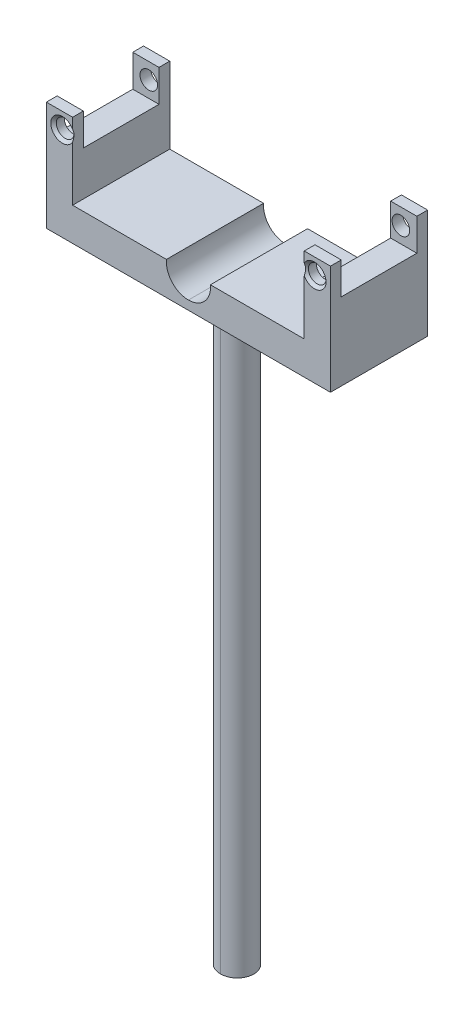
ISO-10303-21;
HEADER;
FILE_DESCRIPTION(('STEP AP214'),'2;1');
FILE_NAME('part.step','',(''),(''),'','','');
FILE_SCHEMA(('AUTOMOTIVE_DESIGN { 1 0 10303 214 1 1 1 1 }'));
ENDSEC;
DATA;
#1=APPLICATION_CONTEXT('core data for automotive mechanical design processes');
#2=APPLICATION_PROTOCOL_DEFINITION('international standard','automotive_design',2000,#1);
#3=PRODUCT_CONTEXT('',#1,'mechanical');
#4=PRODUCT('Part','Part','',(#3));
#5=PRODUCT_RELATED_PRODUCT_CATEGORY('part','',(#4));
#6=PRODUCT_DEFINITION_FORMATION('','',#4);
#7=PRODUCT_DEFINITION_CONTEXT('part definition',#1,'design');
#8=PRODUCT_DEFINITION('design','',#6,#7);
#9=PRODUCT_DEFINITION_SHAPE('','',#8);
#10=(LENGTH_UNIT() NAMED_UNIT(*) SI_UNIT(.MILLI.,.METRE.));
#11=(NAMED_UNIT(*) PLANE_ANGLE_UNIT() SI_UNIT($,.RADIAN.));
#12=(NAMED_UNIT(*) SI_UNIT($,.STERADIAN.) SOLID_ANGLE_UNIT());
#13=UNCERTAINTY_MEASURE_WITH_UNIT(LENGTH_MEASURE(1.E-05),#10,'distance_accuracy_value','');
#14=(GEOMETRIC_REPRESENTATION_CONTEXT(3) GLOBAL_UNCERTAINTY_ASSIGNED_CONTEXT((#13)) GLOBAL_UNIT_ASSIGNED_CONTEXT((#10,
#11,#12)) REPRESENTATION_CONTEXT('',''));
#15=CARTESIAN_POINT('',(0.,0.,0.));
#16=DIRECTION('',(0.,0.,1.));
#17=DIRECTION('',(1.,0.,0.));
#18=AXIS2_PLACEMENT_3D('',#15,#16,#17);
#19=CARTESIAN_POINT('',(0.,19.8,17.6));
#20=DIRECTION('',(0.,-1.,0.));
#21=DIRECTION('',(0.,0.,-1.));
#22=AXIS2_PLACEMENT_3D('',#19,#20,#21);
#23=PLANE('',#22);
#24=DIRECTION('',(0.,0.,-1.));
#25=VECTOR('',#24,1.);
#26=CARTESIAN_POINT('',(0.,19.8,17.6));
#27=LINE('',#26,#25);
#28=CARTESIAN_POINT('',(0.,19.8,1.95));
#29=VERTEX_POINT('',#28);
#30=CARTESIAN_POINT('',(0.,19.8,0.));
#31=VERTEX_POINT('',#30);
#32=EDGE_CURVE('E430',#29,#31,#27,.T.);
#33=ORIENTED_EDGE('',*,*,#32,.F.);
#34=DIRECTION('',(-1.,0.,0.));
#35=VECTOR('',#34,1.);
#36=CARTESIAN_POINT('',(0.,19.8,1.95));
#37=LINE('',#36,#35);
#38=CARTESIAN_POINT('',(4.750417,19.8,1.95));
#39=VERTEX_POINT('',#38);
#40=EDGE_CURVE('E431',#39,#29,#37,.T.);
#41=ORIENTED_EDGE('',*,*,#40,.F.);
#42=DIRECTION('',(0.,0.,-1.));
#43=VECTOR('',#42,1.);
#44=CARTESIAN_POINT('',(4.750417,19.8,17.6));
#45=LINE('',#44,#43);
#46=CARTESIAN_POINT('',(4.750417,19.8,0.));
#47=VERTEX_POINT('',#46);
#48=EDGE_CURVE('E441',#39,#47,#45,.T.);
#49=ORIENTED_EDGE('',*,*,#48,.T.);
#50=DIRECTION('',(-1.,0.,0.));
#51=VECTOR('',#50,1.);
#52=CARTESIAN_POINT('',(0.,19.8,0.));
#53=LINE('',#52,#51);
#54=EDGE_CURVE('E434',#47,#31,#53,.T.);
#55=ORIENTED_EDGE('',*,*,#54,.T.);
#56=EDGE_LOOP('',(#33,#41,#49,#55));
#57=FACE_BOUND('',#56,.T.);
#58=ADVANCED_FACE('F43',(#57),#23,.F.);
#59=CARTESIAN_POINT('',(0.,0.,17.6));
#60=DIRECTION('',(0.,1.,0.));
#61=DIRECTION('',(0.,0.,1.));
#62=AXIS2_PLACEMENT_3D('',#59,#60,#61);
#63=PLANE('',#62);
#64=CARTESIAN_POINT('',(25.6846208878539,0.,8.80012215097253));
#65=DIRECTION('',(0.,1.,0.));
#66=DIRECTION('',(0.,0.,1.));
#67=AXIS2_PLACEMENT_3D('',#64,#65,#66);
#68=CIRCLE('',#67,7.);
#69=CARTESIAN_POINT('',(25.7309872786519,0.,1.80027571281373));
#70=VERTEX_POINT('',#69);
#71=CARTESIAN_POINT('',(25.7309872786519,0.,15.7999685891313));
#72=VERTEX_POINT('',#71);
#73=EDGE_CURVE('E464',#70,#72,#68,.T.);
#74=ORIENTED_EDGE('',*,*,#73,.T.);
#75=CARTESIAN_POINT('',(25.7773536694498,0.,8.80012215097253));
#76=DIRECTION('',(0.,-1.,0.));
#77=DIRECTION('',(0.,0.,1.));
#78=AXIS2_PLACEMENT_3D('',#75,#76,#77);
#79=CIRCLE('',#78,7.);
#80=EDGE_CURVE('E304',#70,#72,#79,.T.);
#81=ORIENTED_EDGE('',*,*,#80,.F.);
#82=EDGE_LOOP('',(#74,#81));
#83=FACE_BOUND('',#82,.T.);
#84=DIRECTION('',(1.,0.,0.));
#85=VECTOR('',#84,1.);
#86=CARTESIAN_POINT('',(0.,0.,0.));
#87=LINE('',#86,#85);
#88=CARTESIAN_POINT('',(0.,0.,0.));
#89=VERTEX_POINT('',#88);
#90=CARTESIAN_POINT('',(51.4619745573037,0.,0.));
#91=VERTEX_POINT('',#90);
#92=EDGE_CURVE('E482',#89,#91,#87,.T.);
#93=ORIENTED_EDGE('',*,*,#92,.T.);
#94=DIRECTION('',(0.,0.,-1.));
#95=VECTOR('',#94,1.);
#96=CARTESIAN_POINT('',(51.4619745573037,0.,17.6));
#97=LINE('',#96,#95);
#98=CARTESIAN_POINT('',(51.4619745573037,0.,17.6));
#99=VERTEX_POINT('',#98);
#100=EDGE_CURVE('E267',#99,#91,#97,.T.);
#101=ORIENTED_EDGE('',*,*,#100,.F.);
#102=DIRECTION('',(1.,0.,0.));
#103=VECTOR('',#102,1.);
#104=CARTESIAN_POINT('',(0.,0.,17.6));
#105=LINE('',#104,#103);
#106=CARTESIAN_POINT('',(0.,0.,17.6));
#107=VERTEX_POINT('',#106);
#108=EDGE_CURVE('E493',#107,#99,#105,.T.);
#109=ORIENTED_EDGE('',*,*,#108,.F.);
#110=DIRECTION('',(0.,0.,-1.));
#111=VECTOR('',#110,1.);
#112=CARTESIAN_POINT('',(0.,0.,17.6));
#113=LINE('',#112,#111);
#114=EDGE_CURVE('E438',#107,#89,#113,.T.);
#115=ORIENTED_EDGE('',*,*,#114,.T.);
#116=EDGE_LOOP('',(#93,#101,#109,#115));
#117=FACE_BOUND('',#116,.T.);
#118=ADVANCED_FACE('F413',(#83,#117),#63,.F.);
#119=CARTESIAN_POINT('',(25.7314326497335,5.61504018958305,17.6));
#120=DIRECTION('',(0.,0.,-1.));
#121=DIRECTION('',(-1.,0.,0.));
#122=AXIS2_PLACEMENT_3D('',#119,#120,#121);
#123=CYLINDRICAL_SURFACE('',#122,4.);
#124=CARTESIAN_POINT('',(25.7314326497335,5.61504018958305,0.));
#125=DIRECTION('',(0.,0.,-1.));
#126=DIRECTION('',(1.,0.,0.));
#127=AXIS2_PLACEMENT_3D('',#124,#125,#126);
#128=CIRCLE('',#127,4.);
#129=CARTESIAN_POINT('',(25.7309872786519,1.61504021437747,0.));
#130=VERTEX_POINT('',#129);
#131=CARTESIAN_POINT('',(21.75,6.,0.));
#132=VERTEX_POINT('',#131);
#133=EDGE_CURVE('E484',#130,#132,#128,.T.);
#134=ORIENTED_EDGE('',*,*,#133,.T.);
#135=DIRECTION('',(0.,0.,-1.));
#136=VECTOR('',#135,1.);
#137=CARTESIAN_POINT('',(21.75,6.,17.6));
#138=LINE('',#137,#136);
#139=CARTESIAN_POINT('',(21.75,6.,17.6));
#140=VERTEX_POINT('',#139);
#141=EDGE_CURVE('E453',#140,#132,#138,.T.);
#142=ORIENTED_EDGE('',*,*,#141,.F.);
#143=CARTESIAN_POINT('',(25.7314326497335,5.61504018958305,17.6));
#144=DIRECTION('',(0.,0.,-1.));
#145=DIRECTION('',(1.,0.,0.));
#146=AXIS2_PLACEMENT_3D('',#143,#144,#145);
#147=CIRCLE('',#146,4.);
#148=CARTESIAN_POINT('',(25.7309872786519,1.61504021437747,17.6));
#149=VERTEX_POINT('',#148);
#150=EDGE_CURVE('E476',#149,#140,#147,.T.);
#151=ORIENTED_EDGE('',*,*,#150,.F.);
#152=DIRECTION('',(0.,0.,-1.));
#153=VECTOR('',#152,1.);
#154=CARTESIAN_POINT('',(25.7309872786519,1.61504021437747,17.6));
#155=LINE('',#154,#153);
#156=EDGE_CURVE('E295',#149,#130,#155,.T.);
#157=ORIENTED_EDGE('',*,*,#156,.T.);
#158=EDGE_LOOP('',(#134,#142,#151,#157));
#159=FACE_BOUND('',#158,.T.);
#160=ADVANCED_FACE('F409',(#159),#123,.F.);
#161=CARTESIAN_POINT('',(4.750417,6.,17.6));
#162=DIRECTION('',(0.,-1.,0.));
#163=DIRECTION('',(0.,0.,-1.));
#164=AXIS2_PLACEMENT_3D('',#161,#162,#163);
#165=PLANE('',#164);
#166=DIRECTION('',(-1.,0.,0.));
#167=VECTOR('',#166,1.);
#168=CARTESIAN_POINT('',(4.750417,6.,0.));
#169=LINE('',#168,#167);
#170=CARTESIAN_POINT('',(4.750417,6.,0.));
#171=VERTEX_POINT('',#170);
#172=EDGE_CURVE('E487',#132,#171,#169,.T.);
#173=ORIENTED_EDGE('',*,*,#172,.T.);
#174=DIRECTION('',(0.,0.,-1.));
#175=VECTOR('',#174,1.);
#176=CARTESIAN_POINT('',(4.750417,6.,17.6));
#177=LINE('',#176,#175);
#178=CARTESIAN_POINT('',(4.750417,6.,17.6));
#179=VERTEX_POINT('',#178);
#180=EDGE_CURVE('E450',#179,#171,#177,.T.);
#181=ORIENTED_EDGE('',*,*,#180,.F.);
#182=DIRECTION('',(-1.,0.,0.));
#183=VECTOR('',#182,1.);
#184=CARTESIAN_POINT('',(4.750417,6.,17.6));
#185=LINE('',#184,#183);
#186=EDGE_CURVE('E473',#140,#179,#185,.T.);
#187=ORIENTED_EDGE('',*,*,#186,.F.);
#188=ORIENTED_EDGE('',*,*,#141,.T.);
#189=EDGE_LOOP('',(#173,#181,#187,#188));
#190=FACE_BOUND('',#189,.T.);
#191=ADVANCED_FACE('F406',(#190),#165,.F.);
#192=CARTESIAN_POINT('',(4.750417,19.8,17.6));
#193=DIRECTION('',(-1.,0.,0.));
#194=DIRECTION('',(0.,-1.,0.));
#195=AXIS2_PLACEMENT_3D('',#192,#193,#194);
#196=PLANE('',#195);
#197=DIRECTION('',(0.,1.,0.));
#198=VECTOR('',#197,1.);
#199=CARTESIAN_POINT('',(4.750417,19.8,17.6));
#200=LINE('',#199,#198);
#201=CARTESIAN_POINT('',(4.750417,17.8929536374429,17.6));
#202=VERTEX_POINT('',#201);
#203=CARTESIAN_POINT('',(4.750417,19.8,17.6));
#204=VERTEX_POINT('',#203);
#205=EDGE_CURVE('E468',#202,#204,#200,.T.);
#206=ORIENTED_EDGE('',*,*,#205,.F.);
#207=CARTESIAN_POINT('',(4.750417,17.8929536374429,17.6));
#208=CARTESIAN_POINT('',(4.750417,17.8237776755279,17.5673092705614));
#209=CARTESIAN_POINT('',(4.750417,17.753489699585,17.5367092353378));
#210=CARTESIAN_POINT('',(4.750417,17.6104070871282,17.4809947338341));
#211=CARTESIAN_POINT('',(4.750417,17.5376021631987,17.4559069097473));
#212=CARTESIAN_POINT('',(4.750417,17.3908553853962,17.4131482006103));
#213=CARTESIAN_POINT('',(4.750417,17.3169421249411,17.3953818109212));
#214=CARTESIAN_POINT('',(4.750417,17.1676977650916,17.3682472863502));
#215=CARTESIAN_POINT('',(4.750417,17.0923698621162,17.3588621102523));
#216=CARTESIAN_POINT('',(4.750417,16.9589342381472,17.3504528214111));
#217=CARTESIAN_POINT('',(4.750417,16.9009432675724,17.3495110079596));
#218=CARTESIAN_POINT('',(4.750417,16.7851084369904,17.3530768047883));
#219=CARTESIAN_POINT('',(4.750417,16.7272646320856,17.357586220559));
#220=CARTESIAN_POINT('',(4.750417,16.6121960179764,17.3717929211864));
#221=CARTESIAN_POINT('',(4.750417,16.554971584294,17.3814931911676));
#222=CARTESIAN_POINT('',(4.750417,16.4415053807776,17.4055665603144));
#223=CARTESIAN_POINT('',(4.750417,16.3852639996284,17.4199414656098));
#224=CARTESIAN_POINT('',(4.750417,16.2569810909495,17.4577254730156));
#225=CARTESIAN_POINT('',(4.750417,16.1853633405545,17.4825529316152));
#226=CARTESIAN_POINT('',(4.750417,16.0444877671429,17.5375888191941));
#227=CARTESIAN_POINT('',(4.750417,15.975222782737,17.5677787679069));
#228=CARTESIAN_POINT('',(4.750417,15.9070463625571,17.6));
#229=B_SPLINE_CURVE_WITH_KNOTS('',3,(#207,#208,#209,#210,#211,#212,#213,#214,#215,#216,#217,
#218,#219,#220,#221,#222,#223,#224,#225,#226,#227,#228),.UNSPECIFIED.,.F.,.F.,(4,2,2,2,2,2,2,2,
2,2,4),(0.,0.229669236507095,0.460425239622334,0.688067809608706,0.915246461414479,
1.08899431652335,1.26279973407762,1.4367052101676,1.61067795776462,1.83781530457767,
2.06418456088828),.UNSPECIFIED.);
#230=CARTESIAN_POINT('',(4.750417,15.9070463625571,17.6));
#231=VERTEX_POINT('',#230);
#232=EDGE_CURVE('E11',#202,#231,#229,.T.);
#233=ORIENTED_EDGE('',*,*,#232,.T.);
#234=EDGE_CURVE('E470',#179,#231,#200,.T.);
#235=ORIENTED_EDGE('',*,*,#234,.F.);
#236=ORIENTED_EDGE('',*,*,#180,.T.);
#237=DIRECTION('',(0.,1.,0.));
#238=VECTOR('',#237,1.);
#239=CARTESIAN_POINT('',(4.750417,19.8,0.));
#240=LINE('',#239,#238);
#241=EDGE_CURVE('E489',#171,#47,#240,.T.);
#242=ORIENTED_EDGE('',*,*,#241,.T.);
#243=ORIENTED_EDGE('',*,*,#48,.F.);
#244=DIRECTION('',(0.,1.,0.));
#245=VECTOR('',#244,1.);
#246=CARTESIAN_POINT('',(4.750417,14.,1.95));
#247=LINE('',#246,#245);
#248=CARTESIAN_POINT('',(4.750417,14.,1.95));
#249=VERTEX_POINT('',#248);
#250=EDGE_CURVE('E503',#249,#39,#247,.T.);
#251=ORIENTED_EDGE('',*,*,#250,.F.);
#252=DIRECTION('',(0.,0.,-1.));
#253=VECTOR('',#252,1.);
#254=CARTESIAN_POINT('',(4.750417,14.,1.95));
#255=LINE('',#254,#253);
#256=CARTESIAN_POINT('',(4.750417,14.,15.65));
#257=VERTEX_POINT('',#256);
#258=EDGE_CURVE('E511',#257,#249,#255,.T.);
#259=ORIENTED_EDGE('',*,*,#258,.F.);
#260=DIRECTION('',(0.,1.,0.));
#261=VECTOR('',#260,1.);
#262=CARTESIAN_POINT('',(4.750417,14.,15.65));
#263=LINE('',#262,#261);
#264=CARTESIAN_POINT('',(4.750417,19.8,15.65));
#265=VERTEX_POINT('',#264);
#266=EDGE_CURVE('E500',#257,#265,#263,.T.);
#267=ORIENTED_EDGE('',*,*,#266,.T.);
#268=EDGE_CURVE('E447',#204,#265,#45,.T.);
#269=ORIENTED_EDGE('',*,*,#268,.F.);
#270=EDGE_LOOP('',(#206,#233,#235,#236,#242,#243,#251,#259,#267,#269));
#271=FACE_BOUND('',#270,.T.);
#272=ADVANCED_FACE('F401',(#271),#196,.F.);
#273=ORIENTED_EDGE('',*,*,#268,.T.);
#274=DIRECTION('',(1.,0.,0.));
#275=VECTOR('',#274,1.);
#276=CARTESIAN_POINT('',(0.,19.8,15.65));
#277=LINE('',#276,#275);
#278=CARTESIAN_POINT('',(0.,19.8,15.65));
#279=VERTEX_POINT('',#278);
#280=EDGE_CURVE('E508',#279,#265,#277,.T.);
#281=ORIENTED_EDGE('',*,*,#280,.F.);
#282=CARTESIAN_POINT('',(0.,19.8,17.6));
#283=VERTEX_POINT('',#282);
#284=EDGE_CURVE('E437',#283,#279,#27,.T.);
#285=ORIENTED_EDGE('',*,*,#284,.F.);
#286=DIRECTION('',(-1.,0.,0.));
#287=VECTOR('',#286,1.);
#288=CARTESIAN_POINT('',(0.,19.8,17.6));
#289=LINE('',#288,#287);
#290=EDGE_CURVE('E475',#204,#283,#289,.T.);
#291=ORIENTED_EDGE('',*,*,#290,.F.);
#292=EDGE_LOOP('',(#273,#281,#285,#291));
#293=FACE_BOUND('',#292,.T.);
#294=ADVANCED_FACE('F398',(#293),#23,.F.);
#295=CARTESIAN_POINT('',(0.,0.,17.6));
#296=DIRECTION('',(1.,0.,0.));
#297=DIRECTION('',(0.,0.,-1.));
#298=AXIS2_PLACEMENT_3D('',#295,#296,#297);
#299=PLANE('',#298);
#300=DIRECTION('',(0.,0.,1.));
#301=VECTOR('',#300,1.);
#302=CARTESIAN_POINT('',(0.,14.,1.95));
#303=LINE('',#302,#301);
#304=CARTESIAN_POINT('',(0.,14.,1.95));
#305=VERTEX_POINT('',#304);
#306=CARTESIAN_POINT('',(0.,14.,15.65));
#307=VERTEX_POINT('',#306);
#308=EDGE_CURVE('E507',#305,#307,#303,.T.);
#309=ORIENTED_EDGE('',*,*,#308,.F.);
#310=DIRECTION('',(0.,1.,0.));
#311=VECTOR('',#310,1.);
#312=CARTESIAN_POINT('',(0.,14.,1.95));
#313=LINE('',#312,#311);
#314=EDGE_CURVE('E485',#305,#29,#313,.T.);
#315=ORIENTED_EDGE('',*,*,#314,.T.);
#316=ORIENTED_EDGE('',*,*,#32,.T.);
#317=DIRECTION('',(0.,-1.,0.));
#318=VECTOR('',#317,1.);
#319=CARTESIAN_POINT('',(0.,0.,0.));
#320=LINE('',#319,#318);
#321=EDGE_CURVE('E492',#31,#89,#320,.T.);
#322=ORIENTED_EDGE('',*,*,#321,.T.);
#323=ORIENTED_EDGE('',*,*,#114,.F.);
#324=DIRECTION('',(0.,-1.,0.));
#325=VECTOR('',#324,1.);
#326=CARTESIAN_POINT('',(0.,0.,17.6));
#327=LINE('',#326,#325);
#328=EDGE_CURVE('E443',#283,#107,#327,.T.);
#329=ORIENTED_EDGE('',*,*,#328,.F.);
#330=ORIENTED_EDGE('',*,*,#284,.T.);
#331=DIRECTION('',(0.,1.,0.));
#332=VECTOR('',#331,1.);
#333=CARTESIAN_POINT('',(0.,14.,15.65));
#334=LINE('',#333,#332);
#335=EDGE_CURVE('E498',#307,#279,#334,.T.);
#336=ORIENTED_EDGE('',*,*,#335,.F.);
#337=EDGE_LOOP('',(#309,#315,#316,#322,#323,#329,#330,#336));
#338=FACE_BOUND('',#337,.T.);
#339=ADVANCED_FACE('F391',(#338),#299,.F.);
#340=CARTESIAN_POINT('',(25.7314326497335,5.61504018958305,17.6));
#341=DIRECTION('',(0.,0.,1.));
#342=DIRECTION('',(1.,0.,0.));
#343=AXIS2_PLACEMENT_3D('',#340,#341,#342);
#344=PLANE('',#343);
#345=ORIENTED_EDGE('',*,*,#234,.T.);
#346=CARTESIAN_POINT('',(2.9,16.9,17.6));
#347=DIRECTION('',(0.,0.,1.));
#348=DIRECTION('',(1.,0.,0.));
#349=AXIS2_PLACEMENT_3D('',#346,#347,#348);
#350=CIRCLE('',#349,2.10000000000003);
#351=EDGE_CURVE('E58',#231,#202,#350,.F.);
#352=ORIENTED_EDGE('',*,*,#351,.T.);
#353=ORIENTED_EDGE('',*,*,#205,.T.);
#354=ORIENTED_EDGE('',*,*,#290,.T.);
#355=ORIENTED_EDGE('',*,*,#328,.T.);
#356=ORIENTED_EDGE('',*,*,#108,.T.);
#357=DIRECTION('',(0.,-1.,0.));
#358=VECTOR('',#357,1.);
#359=CARTESIAN_POINT('',(51.4619745573037,0.,17.6));
#360=LINE('',#359,#358);
#361=CARTESIAN_POINT('',(51.4619745573037,19.8,17.6));
#362=VERTEX_POINT('',#361);
#363=EDGE_CURVE('E264',#362,#99,#360,.T.);
#364=ORIENTED_EDGE('',*,*,#363,.F.);
#365=DIRECTION('',(1.,0.,0.));
#366=VECTOR('',#365,1.);
#367=CARTESIAN_POINT('',(51.4619745573037,19.8,17.6));
#368=LINE('',#367,#366);
#369=CARTESIAN_POINT('',(46.7115575573037,19.8,17.6));
#370=VERTEX_POINT('',#369);
#371=EDGE_CURVE('E261',#370,#362,#368,.T.);
#372=ORIENTED_EDGE('',*,*,#371,.F.);
#373=DIRECTION('',(0.,1.,0.));
#374=VECTOR('',#373,1.);
#375=CARTESIAN_POINT('',(46.7115575573037,19.8,17.6));
#376=LINE('',#375,#374);
#377=CARTESIAN_POINT('',(46.7115575573037,17.8929536374429,17.6));
#378=VERTEX_POINT('',#377);
#379=EDGE_CURVE('E257',#378,#370,#376,.T.);
#380=ORIENTED_EDGE('',*,*,#379,.F.);
#381=CARTESIAN_POINT('',(48.5619745573037,16.9,17.6));
#382=DIRECTION('',(0.,0.,-1.));
#383=DIRECTION('',(-1.,0.,0.));
#384=AXIS2_PLACEMENT_3D('',#381,#382,#383);
#385=CIRCLE('',#384,2.10000000000003);
#386=CARTESIAN_POINT('',(46.7115575573037,15.9070463625571,17.6));
#387=VERTEX_POINT('',#386);
#388=EDGE_CURVE('E354',#387,#378,#385,.F.);
#389=ORIENTED_EDGE('',*,*,#388,.F.);
#390=CARTESIAN_POINT('',(46.7115575573037,6.,17.6));
#391=VERTEX_POINT('',#390);
#392=EDGE_CURVE('E258',#391,#387,#376,.T.);
#393=ORIENTED_EDGE('',*,*,#392,.F.);
#394=DIRECTION('',(1.,0.,0.));
#395=VECTOR('',#394,1.);
#396=CARTESIAN_POINT('',(46.7115575573037,6.,17.6));
#397=LINE('',#396,#395);
#398=CARTESIAN_POINT('',(29.7119745573037,6.,17.6));
#399=VERTEX_POINT('',#398);
#400=EDGE_CURVE('E253',#399,#391,#397,.T.);
#401=ORIENTED_EDGE('',*,*,#400,.F.);
#402=CARTESIAN_POINT('',(25.7305419075702,5.61504018958305,17.6));
#403=DIRECTION('',(0.,0.,1.));
#404=DIRECTION('',(-1.,0.,0.));
#405=AXIS2_PLACEMENT_3D('',#402,#403,#404);
#406=CIRCLE('',#405,4.);
#407=EDGE_CURVE('E250',#149,#399,#406,.T.);
#408=ORIENTED_EDGE('',*,*,#407,.F.);
#409=ORIENTED_EDGE('',*,*,#150,.T.);
#410=ORIENTED_EDGE('',*,*,#186,.T.);
#411=EDGE_LOOP('',(#345,#352,#353,#354,#355,#356,#364,#372,#380,#389,#393,#401,#408,#409,#410));
#412=FACE_BOUND('',#411,.T.);
#413=ADVANCED_FACE('F388',(#412),#344,.T.);
#414=CARTESIAN_POINT('',(25.7314326497335,5.61504018958305,0.));
#415=DIRECTION('',(0.,0.,1.));
#416=DIRECTION('',(1.,0.,0.));
#417=AXIS2_PLACEMENT_3D('',#414,#415,#416);
#418=PLANE('',#417);
#419=CARTESIAN_POINT('',(2.9,16.9,0.));
#420=DIRECTION('',(0.,0.,-1.));
#421=DIRECTION('',(-1.,0.,0.));
#422=AXIS2_PLACEMENT_3D('',#419,#420,#421);
#423=CIRCLE('',#422,1.6);
#424=CARTESIAN_POINT('',(1.3,16.9,0.));
#425=VERTEX_POINT('',#424);
#426=EDGE_CURVE('E461',#425,#425,#423,.T.);
#427=ORIENTED_EDGE('',*,*,#426,.F.);
#428=EDGE_LOOP('',(#427));
#429=FACE_BOUND('',#428,.T.);
#430=ORIENTED_EDGE('',*,*,#92,.F.);
#431=ORIENTED_EDGE('',*,*,#321,.F.);
#432=ORIENTED_EDGE('',*,*,#54,.F.);
#433=ORIENTED_EDGE('',*,*,#241,.F.);
#434=ORIENTED_EDGE('',*,*,#172,.F.);
#435=ORIENTED_EDGE('',*,*,#133,.F.);
#436=CARTESIAN_POINT('',(25.7305419075702,5.61504018958305,0.));
#437=DIRECTION('',(0.,0.,1.));
#438=DIRECTION('',(-1.,0.,0.));
#439=AXIS2_PLACEMENT_3D('',#436,#437,#438);
#440=CIRCLE('',#439,4.);
#441=CARTESIAN_POINT('',(29.7119745573037,6.,0.));
#442=VERTEX_POINT('',#441);
#443=EDGE_CURVE('E246',#130,#442,#440,.T.);
#444=ORIENTED_EDGE('',*,*,#443,.T.);
#445=DIRECTION('',(1.,0.,0.));
#446=VECTOR('',#445,1.);
#447=CARTESIAN_POINT('',(46.7115575573037,6.,0.));
#448=LINE('',#447,#446);
#449=CARTESIAN_POINT('',(46.7115575573037,6.,0.));
#450=VERTEX_POINT('',#449);
#451=EDGE_CURVE('E270',#442,#450,#448,.T.);
#452=ORIENTED_EDGE('',*,*,#451,.T.);
#453=DIRECTION('',(0.,1.,0.));
#454=VECTOR('',#453,1.);
#455=CARTESIAN_POINT('',(46.7115575573037,19.8,0.));
#456=LINE('',#455,#454);
#457=CARTESIAN_POINT('',(46.7115575573037,19.8,0.));
#458=VERTEX_POINT('',#457);
#459=EDGE_CURVE('E273',#450,#458,#456,.T.);
#460=ORIENTED_EDGE('',*,*,#459,.T.);
#461=DIRECTION('',(1.,0.,0.));
#462=VECTOR('',#461,1.);
#463=CARTESIAN_POINT('',(51.4619745573037,19.8,0.));
#464=LINE('',#463,#462);
#465=CARTESIAN_POINT('',(51.4619745573037,19.8,0.));
#466=VERTEX_POINT('',#465);
#467=EDGE_CURVE('E275',#458,#466,#464,.T.);
#468=ORIENTED_EDGE('',*,*,#467,.T.);
#469=DIRECTION('',(0.,-1.,0.));
#470=VECTOR('',#469,1.);
#471=CARTESIAN_POINT('',(51.4619745573037,0.,0.));
#472=LINE('',#471,#470);
#473=EDGE_CURVE('E254',#466,#91,#472,.T.);
#474=ORIENTED_EDGE('',*,*,#473,.T.);
#475=EDGE_LOOP('',(#430,#431,#432,#433,#434,#435,#444,#452,#460,#468,#474));
#476=FACE_BOUND('',#475,.T.);
#477=CARTESIAN_POINT('',(48.5619745573037,16.9,0.));
#478=DIRECTION('',(0.,0.,1.));
#479=DIRECTION('',(1.,0.,0.));
#480=AXIS2_PLACEMENT_3D('',#477,#478,#479);
#481=CIRCLE('',#480,1.6);
#482=CARTESIAN_POINT('',(50.1619745573037,16.9,0.));
#483=VERTEX_POINT('',#482);
#484=EDGE_CURVE('E301',#483,#483,#481,.T.);
#485=ORIENTED_EDGE('',*,*,#484,.T.);
#486=EDGE_LOOP('',(#485));
#487=FACE_BOUND('',#486,.T.);
#488=ADVANCED_FACE('F383',(#429,#476,#487),#418,.F.);
#489=CARTESIAN_POINT('',(0.,14.,1.95));
#490=DIRECTION('',(0.,0.,-1.));
#491=DIRECTION('',(-1.,0.,0.));
#492=AXIS2_PLACEMENT_3D('',#489,#490,#491);
#493=PLANE('',#492);
#494=CARTESIAN_POINT('',(2.9,16.9,1.95));
#495=DIRECTION('',(0.,0.,-1.));
#496=DIRECTION('',(-1.,0.,0.));
#497=AXIS2_PLACEMENT_3D('',#494,#495,#496);
#498=CIRCLE('',#497,1.6);
#499=CARTESIAN_POINT('',(1.3,16.9,1.95));
#500=VERTEX_POINT('',#499);
#501=EDGE_CURVE('E460',#500,#500,#498,.T.);
#502=ORIENTED_EDGE('',*,*,#501,.T.);
#503=EDGE_LOOP('',(#502));
#504=FACE_BOUND('',#503,.T.);
#505=ORIENTED_EDGE('',*,*,#40,.T.);
#506=ORIENTED_EDGE('',*,*,#314,.F.);
#507=DIRECTION('',(-1.,0.,0.));
#508=VECTOR('',#507,1.);
#509=CARTESIAN_POINT('',(0.,14.,1.95));
#510=LINE('',#509,#508);
#511=EDGE_CURVE('E501',#249,#305,#510,.T.);
#512=ORIENTED_EDGE('',*,*,#511,.F.);
#513=ORIENTED_EDGE('',*,*,#250,.T.);
#514=EDGE_LOOP('',(#505,#506,#512,#513));
#515=FACE_BOUND('',#514,.T.);
#516=ADVANCED_FACE('F380',(#504,#515),#493,.F.);
#517=CARTESIAN_POINT('',(0.,14.,15.65));
#518=DIRECTION('',(0.,0.,1.));
#519=DIRECTION('',(1.,0.,0.));
#520=AXIS2_PLACEMENT_3D('',#517,#518,#519);
#521=PLANE('',#520);
#522=CARTESIAN_POINT('',(2.9,16.9,15.65));
#523=DIRECTION('',(0.,0.,1.));
#524=DIRECTION('',(1.,0.,0.));
#525=AXIS2_PLACEMENT_3D('',#522,#523,#524);
#526=CIRCLE('',#525,1.6);
#527=CARTESIAN_POINT('',(4.5,16.9,15.65));
#528=VERTEX_POINT('',#527);
#529=EDGE_CURVE('E457',#528,#528,#526,.T.);
#530=ORIENTED_EDGE('',*,*,#529,.T.);
#531=EDGE_LOOP('',(#530));
#532=FACE_BOUND('',#531,.T.);
#533=ORIENTED_EDGE('',*,*,#280,.T.);
#534=ORIENTED_EDGE('',*,*,#266,.F.);
#535=DIRECTION('',(1.,0.,0.));
#536=VECTOR('',#535,1.);
#537=CARTESIAN_POINT('',(0.,14.,15.65));
#538=LINE('',#537,#536);
#539=EDGE_CURVE('E513',#307,#257,#538,.T.);
#540=ORIENTED_EDGE('',*,*,#539,.F.);
#541=ORIENTED_EDGE('',*,*,#335,.T.);
#542=EDGE_LOOP('',(#533,#534,#540,#541));
#543=FACE_BOUND('',#542,.T.);
#544=ADVANCED_FACE('F378',(#532,#543),#521,.F.);
#545=CARTESIAN_POINT('',(0.,14.,0.));
#546=DIRECTION('',(0.,1.,0.));
#547=DIRECTION('',(0.,0.,1.));
#548=AXIS2_PLACEMENT_3D('',#545,#546,#547);
#549=PLANE('',#548);
#550=ORIENTED_EDGE('',*,*,#308,.T.);
#551=ORIENTED_EDGE('',*,*,#539,.T.);
#552=ORIENTED_EDGE('',*,*,#258,.T.);
#553=ORIENTED_EDGE('',*,*,#511,.T.);
#554=EDGE_LOOP('',(#550,#551,#552,#553));
#555=FACE_BOUND('',#554,.T.);
#556=ADVANCED_FACE('F375',(#555),#549,.T.);
#557=CARTESIAN_POINT('',(2.9,16.9,17.8));
#558=DIRECTION('',(0.,0.,-1.));
#559=DIRECTION('',(-1.,0.,0.));
#560=AXIS2_PLACEMENT_3D('',#557,#558,#559);
#561=CYLINDRICAL_SURFACE('',#560,1.6);
#562=CARTESIAN_POINT('',(2.9,16.9,17.1));
#563=DIRECTION('',(0.,0.,1.));
#564=DIRECTION('',(1.,0.,0.));
#565=AXIS2_PLACEMENT_3D('',#562,#563,#564);
#566=CIRCLE('',#565,1.6);
#567=CARTESIAN_POINT('',(4.5,16.9,17.1));
#568=VERTEX_POINT('',#567);
#569=EDGE_CURVE('E466',#568,#568,#566,.T.);
#570=ORIENTED_EDGE('',*,*,#569,.T.);
#571=EDGE_LOOP('',(#570));
#572=FACE_BOUND('',#571,.T.);
#573=ORIENTED_EDGE('',*,*,#529,.F.);
#574=EDGE_LOOP('',(#573));
#575=FACE_BOUND('',#574,.T.);
#576=ADVANCED_FACE('F373',(#572,#575),#561,.F.);
#577=ORIENTED_EDGE('',*,*,#426,.T.);
#578=EDGE_LOOP('',(#577));
#579=FACE_BOUND('',#578,.T.);
#580=ORIENTED_EDGE('',*,*,#501,.F.);
#581=EDGE_LOOP('',(#580));
#582=FACE_BOUND('',#581,.T.);
#583=ADVANCED_FACE('F369',(#579,#582),#561,.F.);
#584=CARTESIAN_POINT('',(25.6846208878539,-107.,8.80012215097253));
#585=DIRECTION('',(0.,1.,0.));
#586=DIRECTION('',(0.,0.,1.));
#587=AXIS2_PLACEMENT_3D('',#584,#585,#586);
#588=CYLINDRICAL_SURFACE('',#587,3.);
#589=DIRECTION('',(0.,1.,0.));
#590=VECTOR('',#589,1.);
#591=CARTESIAN_POINT('',(25.7309872786519,-107.,11.79976382254));
#592=LINE('',#591,#590);
#593=CARTESIAN_POINT('',(25.7309872786519,-107.,11.79976382254));
#594=VERTEX_POINT('',#593);
#595=CARTESIAN_POINT('',(25.7309872786519,-4.,11.79976382254));
#596=VERTEX_POINT('',#595);
#597=EDGE_CURVE('E531',#594,#596,#592,.T.);
#598=ORIENTED_EDGE('',*,*,#597,.T.);
#599=CARTESIAN_POINT('',(25.6846208878539,-4.,8.80012215097253));
#600=DIRECTION('',(0.,1.,0.));
#601=DIRECTION('',(0.,0.,1.));
#602=AXIS2_PLACEMENT_3D('',#599,#600,#601);
#603=CIRCLE('',#602,3.);
#604=CARTESIAN_POINT('',(25.7309872786519,-4.,5.80048047940501));
#605=VERTEX_POINT('',#604);
#606=EDGE_CURVE('E456',#596,#605,#603,.F.);
#607=ORIENTED_EDGE('',*,*,#606,.T.);
#608=DIRECTION('',(0.,1.,0.));
#609=VECTOR('',#608,1.);
#610=CARTESIAN_POINT('',(25.7309872786519,-107.,5.80048047940501));
#611=LINE('',#610,#609);
#612=CARTESIAN_POINT('',(25.7309872786519,-107.,5.80048047940501));
#613=VERTEX_POINT('',#612);
#614=EDGE_CURVE('E527',#613,#605,#611,.T.);
#615=ORIENTED_EDGE('',*,*,#614,.F.);
#616=CARTESIAN_POINT('',(25.6846208878539,-107.,8.80012215097253));
#617=DIRECTION('',(0.,-1.,0.));
#618=DIRECTION('',(0.,0.,-1.));
#619=AXIS2_PLACEMENT_3D('',#616,#617,#618);
#620=CIRCLE('',#619,3.);
#621=EDGE_CURVE('E353',#594,#613,#620,.T.);
#622=ORIENTED_EDGE('',*,*,#621,.F.);
#623=EDGE_LOOP('',(#598,#607,#615,#622));
#624=FACE_BOUND('',#623,.T.);
#625=ADVANCED_FACE('F365',(#624),#588,.T.);
#626=CARTESIAN_POINT('',(25.6846208878539,-107.,8.80012215097253));
#627=DIRECTION('',(0.,-1.,0.));
#628=DIRECTION('',(0.,0.,-1.));
#629=AXIS2_PLACEMENT_3D('',#626,#627,#628);
#630=PLANE('',#629);
#631=ORIENTED_EDGE('',*,*,#621,.T.);
#632=CARTESIAN_POINT('',(25.7773536694498,-107.,8.80012215097253));
#633=DIRECTION('',(0.,1.,0.));
#634=DIRECTION('',(0.,0.,-1.));
#635=AXIS2_PLACEMENT_3D('',#632,#633,#634);
#636=CIRCLE('',#635,3.);
#637=EDGE_CURVE('E524',#594,#613,#636,.T.);
#638=ORIENTED_EDGE('',*,*,#637,.F.);
#639=EDGE_LOOP('',(#631,#638));
#640=FACE_BOUND('',#639,.T.);
#641=ADVANCED_FACE('F361',(#640),#630,.T.);
#642=CARTESIAN_POINT('',(25.6846208878539,-4.,8.80012215097253));
#643=DIRECTION('',(0.,1.,0.));
#644=DIRECTION('',(0.,0.,1.));
#645=AXIS2_PLACEMENT_3D('',#642,#643,#644);
#646=TOROIDAL_SURFACE('',#645,7.,4.);
#647=CARTESIAN_POINT('',(25.7309872786519,0.,15.7999685891313));
#648=CARTESIAN_POINT('',(25.7309872786519,1.07813474887065E-05,15.6874551845406));
#649=CARTESIAN_POINT('',(25.7309872786519,-0.00474697762869978,15.5749468956393));
#650=CARTESIAN_POINT('',(25.7309872786519,-0.0237160804432443,15.3507353301587));
#651=CARTESIAN_POINT('',(25.7309872786519,-0.0379269695764418,15.2390320151206));
#652=CARTESIAN_POINT('',(25.7309872786519,-0.0757045619216881,15.0172980775003));
#653=CARTESIAN_POINT('',(25.7309872786519,-0.0992641817201619,14.9072662538369));
#654=CARTESIAN_POINT('',(25.7309872786519,-0.155548072564884,14.6896052215831));
#655=CARTESIAN_POINT('',(25.7309872786519,-0.188272232065065,14.5819759837668));
#656=CARTESIAN_POINT('',(25.7309872786519,-0.29992702139657,14.2637307603212));
#657=CARTESIAN_POINT('',(25.7309872786519,-0.392355446302333,14.0576668636265));
#658=CARTESIAN_POINT('',(25.7309872786519,-0.610433786275645,13.6641323419197));
#659=CARTESIAN_POINT('',(25.7309872786519,-0.736077862690431,13.4766584571086));
#660=CARTESIAN_POINT('',(25.7309872786519,-1.01706546976594,13.1254305745651));
#661=CARTESIAN_POINT('',(25.7309872786519,-1.17240922475912,12.9616767560153));
#662=CARTESIAN_POINT('',(25.7309872786519,-1.50841728609961,12.6625490181306));
#663=CARTESIAN_POINT('',(25.7309872786519,-1.68908654544028,12.5271806631921));
#664=CARTESIAN_POINT('',(25.7309872786519,-2.070604487002,12.2886797598061));
#665=CARTESIAN_POINT('',(25.7309872786519,-2.27145686965707,12.1855531369556));
#666=CARTESIAN_POINT('',(25.7309872786519,-2.6875855202925,12.0145412937713));
#667=CARTESIAN_POINT('',(25.7309872786519,-2.90285323102408,11.9466353714315));
#668=CARTESIAN_POINT('',(25.7309872786519,-3.26619982106527,11.8648786796595));
#669=CARTESIAN_POINT('',(25.7309872786519,-3.41199164706005,11.8404754267754));
#670=CARTESIAN_POINT('',(25.7309872786519,-3.70516858749308,11.8079201074899));
#671=CARTESIAN_POINT('',(25.7309872786519,-3.85255114710197,11.7997450266292));
#672=CARTESIAN_POINT('',(25.7309872786519,-4.,11.79976382254));
#673=B_SPLINE_CURVE_WITH_KNOTS('',3,(#647,#648,#649,#650,#651,#652,#653,#654,#655,#656,#657,
#658,#659,#660,#661,#662,#663,#664,#665,#666,#667,#668,#669,#670,#671,#672),.UNSPECIFIED.,.F.,
.F.,(4,2,2,2,2,2,2,2,2,2,2,2,4),(0.,0.337430431331106,0.674844633089397,1.012003667093,
1.34915859754844,2.02319677181156,2.69711654222254,3.37104140319524,4.04509825026923,
4.71927890720345,5.39306284420293,5.83568204737397,6.27767308737708),.UNSPECIFIED.);
#674=EDGE_CURVE('E316',#72,#596,#673,.T.);
#675=ORIENTED_EDGE('',*,*,#674,.F.);
#676=ORIENTED_EDGE('',*,*,#73,.F.);
#677=CARTESIAN_POINT('',(25.7309872786519,-4.,5.80048047940501));
#678=CARTESIAN_POINT('',(25.7309872786519,-3.87172069542226,5.8004993738924));
#679=CARTESIAN_POINT('',(25.7309872786519,-3.74344832267944,5.79430924011823));
#680=CARTESIAN_POINT('',(25.7309872786519,-3.48808200202148,5.76965268593534));
#681=CARTESIAN_POINT('',(25.7309872786519,-3.36098811313224,5.75118565395402));
#682=CARTESIAN_POINT('',(25.7309872786519,-3.10943416964834,5.70217123461901));
#683=CARTESIAN_POINT('',(25.7309872786519,-2.98496892227049,5.67165059249355));
#684=CARTESIAN_POINT('',(25.7309872786519,-2.73958603539904,5.59884594538729));
#685=CARTESIAN_POINT('',(25.7309872786519,-2.61866781248328,5.55656388707909));
#686=CARTESIAN_POINT('',(25.7309872786519,-2.29158835611357,5.42421942364893));
#687=CARTESIAN_POINT('',(25.7309872786519,-2.09011799628685,5.32220501190389));
#688=CARTESIAN_POINT('',(25.7309872786519,-1.70734672152638,5.0858903707339));
#689=CARTESIAN_POINT('',(25.7309872786519,-1.52603712795584,4.95160411273572));
#690=CARTESIAN_POINT('',(25.7309872786519,-1.18847450145478,4.65447674086562));
#691=CARTESIAN_POINT('',(25.7309872786519,-1.03222520791928,4.49163137309592));
#692=CARTESIAN_POINT('',(25.7309872786519,-0.749232078867031,4.14195707984478));
#693=CARTESIAN_POINT('',(25.7309872786519,-0.622498859829937,3.95511956212505));
#694=CARTESIAN_POINT('',(25.7309872786519,-0.402162800396024,3.56277661759847));
#695=CARTESIAN_POINT('',(25.7309872786519,-0.308571823262727,3.35726453924402));
#696=CARTESIAN_POINT('',(25.7309872786519,-0.157307752320244,2.93353272539272));
#697=CARTESIAN_POINT('',(25.7309872786519,-0.0996000376716636,2.71532546148421));
#698=CARTESIAN_POINT('',(25.7309872786519,-0.0404339543290486,2.37944574553834));
#699=CARTESIAN_POINT('',(25.7309872786519,-0.0252701767333418,2.26403038128232));
#700=CARTESIAN_POINT('',(25.7309872786519,-0.00506177451145496,2.03251934729279));
#701=CARTESIAN_POINT('',(25.7309872786519,4.04479669644631E-07,1.91642520996453));
#702=CARTESIAN_POINT('',(25.7309872786519,0.,1.80027571281373));
#703=B_SPLINE_CURVE_WITH_KNOTS('',3,(#677,#678,#679,#680,#681,#682,#683,#684,#685,#686,#687,
#688,#689,#690,#691,#692,#693,#694,#695,#696,#697,#698,#699,#700,#701,#702),.UNSPECIFIED.,.F.,
.F.,(4,2,2,2,2,2,2,2,2,2,2,2,4),(0.,0.384676730724186,0.769372625521393,1.15321968836108,
1.53700325711201,2.21102734828041,2.88476015870739,3.55859340743444,4.23266865063257,
4.90698493570645,5.58064961427457,5.92948476644149,6.27771318979782),.UNSPECIFIED.);
#704=EDGE_CURVE('E307',#605,#70,#703,.T.);
#705=ORIENTED_EDGE('',*,*,#704,.F.);
#706=ORIENTED_EDGE('',*,*,#606,.F.);
#707=EDGE_LOOP('',(#675,#676,#705,#706));
#708=FACE_BOUND('',#707,.T.);
#709=ADVANCED_FACE('F364',(#708),#646,.F.);
#710=CARTESIAN_POINT('',(2.9,16.9,17.1));
#711=DIRECTION('',(0.,0.,1.));
#712=DIRECTION('',(1.,0.,0.));
#713=AXIS2_PLACEMENT_3D('',#710,#711,#712);
#714=CONICAL_SURFACE('',#713,1.6,0.785398163397459);
#715=ORIENTED_EDGE('',*,*,#232,.F.);
#716=ORIENTED_EDGE('',*,*,#351,.F.);
#717=EDGE_LOOP('',(#715,#716));
#718=FACE_BOUND('',#717,.T.);
#719=ORIENTED_EDGE('',*,*,#569,.F.);
#720=EDGE_LOOP('',(#719));
#721=FACE_BOUND('',#720,.T.);
#722=ADVANCED_FACE('F46',(#718,#721),#714,.F.);
#723=CARTESIAN_POINT('',(51.4619745573037,19.8,17.6));
#724=DIRECTION('',(0.,-1.,0.));
#725=DIRECTION('',(0.,0.,-1.));
#726=AXIS2_PLACEMENT_3D('',#723,#724,#725);
#727=PLANE('',#726);
#728=DIRECTION('',(0.,0.,-1.));
#729=VECTOR('',#728,1.);
#730=CARTESIAN_POINT('',(51.4619745573037,19.8,17.6));
#731=LINE('',#730,#729);
#732=CARTESIAN_POINT('',(51.4619745573037,19.8,1.95));
#733=VERTEX_POINT('',#732);
#734=EDGE_CURVE('E282',#733,#466,#731,.T.);
#735=ORIENTED_EDGE('',*,*,#734,.T.);
#736=ORIENTED_EDGE('',*,*,#467,.F.);
#737=DIRECTION('',(0.,0.,-1.));
#738=VECTOR('',#737,1.);
#739=CARTESIAN_POINT('',(46.7115575573037,19.8,17.6));
#740=LINE('',#739,#738);
#741=CARTESIAN_POINT('',(46.7115575573037,19.8,1.95));
#742=VERTEX_POINT('',#741);
#743=EDGE_CURVE('E285',#742,#458,#740,.T.);
#744=ORIENTED_EDGE('',*,*,#743,.F.);
#745=DIRECTION('',(1.,0.,0.));
#746=VECTOR('',#745,1.);
#747=CARTESIAN_POINT('',(51.4619745573037,19.8,1.95));
#748=LINE('',#747,#746);
#749=EDGE_CURVE('E234',#742,#733,#748,.T.);
#750=ORIENTED_EDGE('',*,*,#749,.T.);
#751=EDGE_LOOP('',(#735,#736,#744,#750));
#752=FACE_BOUND('',#751,.T.);
#753=ADVANCED_FACE('F332',(#752),#727,.F.);
#754=CARTESIAN_POINT('',(25.7305419075702,5.61504018958305,17.6));
#755=DIRECTION('',(0.,0.,-1.));
#756=DIRECTION('',(1.,0.,0.));
#757=AXIS2_PLACEMENT_3D('',#754,#755,#756);
#758=CYLINDRICAL_SURFACE('',#757,4.);
#759=ORIENTED_EDGE('',*,*,#443,.F.);
#760=ORIENTED_EDGE('',*,*,#156,.F.);
#761=ORIENTED_EDGE('',*,*,#407,.T.);
#762=DIRECTION('',(0.,0.,-1.));
#763=VECTOR('',#762,1.);
#764=CARTESIAN_POINT('',(29.7119745573037,6.,17.6));
#765=LINE('',#764,#763);
#766=EDGE_CURVE('E292',#399,#442,#765,.T.);
#767=ORIENTED_EDGE('',*,*,#766,.T.);
#768=EDGE_LOOP('',(#759,#760,#761,#767));
#769=FACE_BOUND('',#768,.T.);
#770=ADVANCED_FACE('F327',(#769),#758,.F.);
#771=CARTESIAN_POINT('',(46.7115575573037,6.,17.6));
#772=DIRECTION('',(0.,-1.,0.));
#773=DIRECTION('',(0.,0.,-1.));
#774=AXIS2_PLACEMENT_3D('',#771,#772,#773);
#775=PLANE('',#774);
#776=ORIENTED_EDGE('',*,*,#451,.F.);
#777=ORIENTED_EDGE('',*,*,#766,.F.);
#778=ORIENTED_EDGE('',*,*,#400,.T.);
#779=DIRECTION('',(0.,0.,-1.));
#780=VECTOR('',#779,1.);
#781=CARTESIAN_POINT('',(46.7115575573037,6.,17.6));
#782=LINE('',#781,#780);
#783=EDGE_CURVE('E289',#391,#450,#782,.T.);
#784=ORIENTED_EDGE('',*,*,#783,.T.);
#785=EDGE_LOOP('',(#776,#777,#778,#784));
#786=FACE_BOUND('',#785,.T.);
#787=ADVANCED_FACE('F331',(#786),#775,.F.);
#788=CARTESIAN_POINT('',(46.7115575573037,19.8,17.6));
#789=DIRECTION('',(1.,0.,0.));
#790=DIRECTION('',(0.,-1.,0.));
#791=AXIS2_PLACEMENT_3D('',#788,#789,#790);
#792=PLANE('',#791);
#793=ORIENTED_EDGE('',*,*,#379,.T.);
#794=CARTESIAN_POINT('',(46.7115575573037,19.8,15.65));
#795=VERTEX_POINT('',#794);
#796=EDGE_CURVE('E286',#370,#795,#740,.T.);
#797=ORIENTED_EDGE('',*,*,#796,.T.);
#798=DIRECTION('',(0.,1.,0.));
#799=VECTOR('',#798,1.);
#800=CARTESIAN_POINT('',(46.7115575573037,14.,15.65));
#801=LINE('',#800,#799);
#802=CARTESIAN_POINT('',(46.7115575573037,14.,15.65));
#803=VERTEX_POINT('',#802);
#804=EDGE_CURVE('E227',#803,#795,#801,.T.);
#805=ORIENTED_EDGE('',*,*,#804,.F.);
#806=DIRECTION('',(0.,0.,-1.));
#807=VECTOR('',#806,1.);
#808=CARTESIAN_POINT('',(46.7115575573037,14.,1.95));
#809=LINE('',#808,#807);
#810=CARTESIAN_POINT('',(46.7115575573037,14.,1.95));
#811=VERTEX_POINT('',#810);
#812=EDGE_CURVE('E215',#803,#811,#809,.T.);
#813=ORIENTED_EDGE('',*,*,#812,.T.);
#814=DIRECTION('',(0.,1.,0.));
#815=VECTOR('',#814,1.);
#816=CARTESIAN_POINT('',(46.7115575573037,14.,1.95));
#817=LINE('',#816,#815);
#818=EDGE_CURVE('E247',#811,#742,#817,.T.);
#819=ORIENTED_EDGE('',*,*,#818,.T.);
#820=ORIENTED_EDGE('',*,*,#743,.T.);
#821=ORIENTED_EDGE('',*,*,#459,.F.);
#822=ORIENTED_EDGE('',*,*,#783,.F.);
#823=ORIENTED_EDGE('',*,*,#392,.T.);
#824=CARTESIAN_POINT('',(46.7115575573037,17.8929536374429,17.6));
#825=CARTESIAN_POINT('',(46.7115575573037,17.8237776755279,17.5673092705614));
#826=CARTESIAN_POINT('',(46.7115575573037,17.753489699585,17.5367092353378));
#827=CARTESIAN_POINT('',(46.7115575573037,17.6104070871282,17.4809947338341));
#828=CARTESIAN_POINT('',(46.7115575573037,17.5376021631987,17.4559069097473));
#829=CARTESIAN_POINT('',(46.7115575573037,17.3908553853962,17.4131482006103));
#830=CARTESIAN_POINT('',(46.7115575573037,17.3169421249411,17.3953818109212));
#831=CARTESIAN_POINT('',(46.7115575573037,17.1676977650916,17.3682472863502));
#832=CARTESIAN_POINT('',(46.7115575573037,17.0923698621162,17.3588621102523));
#833=CARTESIAN_POINT('',(46.7115575573037,16.9589342381472,17.3504528214111));
#834=CARTESIAN_POINT('',(46.7115575573037,16.9009432675724,17.3495110079596));
#835=CARTESIAN_POINT('',(46.7115575573037,16.7851084369904,17.3530768047883));
#836=CARTESIAN_POINT('',(46.7115575573037,16.7272646320856,17.357586220559));
#837=CARTESIAN_POINT('',(46.7115575573037,16.6121960179764,17.3717929211864));
#838=CARTESIAN_POINT('',(46.7115575573037,16.554971584294,17.3814931911676));
#839=CARTESIAN_POINT('',(46.7115575573037,16.4415053807776,17.4055665603144));
#840=CARTESIAN_POINT('',(46.7115575573037,16.3852639996284,17.4199414656098));
#841=CARTESIAN_POINT('',(46.7115575573037,16.2569810909495,17.4577254730156));
#842=CARTESIAN_POINT('',(46.7115575573037,16.1853633405545,17.4825529316152));
#843=CARTESIAN_POINT('',(46.7115575573037,16.0444877671429,17.5375888191941));
#844=CARTESIAN_POINT('',(46.7115575573037,15.975222782737,17.5677787679069));
#845=CARTESIAN_POINT('',(46.7115575573037,15.9070463625571,17.6));
#846=B_SPLINE_CURVE_WITH_KNOTS('',3,(#824,#825,#826,#827,#828,#829,#830,#831,#832,#833,#834,
#835,#836,#837,#838,#839,#840,#841,#842,#843,#844,#845),.UNSPECIFIED.,.F.,.F.,(4,2,2,2,2,2,2,2,
2,2,4),(0.,0.229669236507095,0.460425239622334,0.688067809608706,0.915246461414479,
1.08899431652335,1.26279973407762,1.4367052101676,1.61067795776462,1.83781530457767,
2.06418456088828),.UNSPECIFIED.);
#847=EDGE_CURVE('E345',#378,#387,#846,.T.);
#848=ORIENTED_EDGE('',*,*,#847,.F.);
#849=EDGE_LOOP('',(#793,#797,#805,#813,#819,#820,#821,#822,#823,#848));
#850=FACE_BOUND('',#849,.T.);
#851=ADVANCED_FACE('F336',(#850),#792,.F.);
#852=ORIENTED_EDGE('',*,*,#796,.F.);
#853=ORIENTED_EDGE('',*,*,#371,.T.);
#854=CARTESIAN_POINT('',(51.4619745573037,19.8,15.65));
#855=VERTEX_POINT('',#854);
#856=EDGE_CURVE('E283',#362,#855,#731,.T.);
#857=ORIENTED_EDGE('',*,*,#856,.T.);
#858=DIRECTION('',(-1.,0.,0.));
#859=VECTOR('',#858,1.);
#860=CARTESIAN_POINT('',(51.4619745573037,19.8,15.65));
#861=LINE('',#860,#859);
#862=EDGE_CURVE('E223',#855,#795,#861,.T.);
#863=ORIENTED_EDGE('',*,*,#862,.T.);
#864=EDGE_LOOP('',(#852,#853,#857,#863));
#865=FACE_BOUND('',#864,.T.);
#866=ADVANCED_FACE('F341',(#865),#727,.F.);
#867=CARTESIAN_POINT('',(51.4619745573037,0.,17.6));
#868=DIRECTION('',(-1.,0.,0.));
#869=DIRECTION('',(0.,0.,-1.));
#870=AXIS2_PLACEMENT_3D('',#867,#868,#869);
#871=PLANE('',#870);
#872=DIRECTION('',(0.,0.,1.));
#873=VECTOR('',#872,1.);
#874=CARTESIAN_POINT('',(51.4619745573037,14.,1.95));
#875=LINE('',#874,#873);
#876=CARTESIAN_POINT('',(51.4619745573037,14.,1.95));
#877=VERTEX_POINT('',#876);
#878=CARTESIAN_POINT('',(51.4619745573037,14.,15.65));
#879=VERTEX_POINT('',#878);
#880=EDGE_CURVE('E213',#877,#879,#875,.T.);
#881=ORIENTED_EDGE('',*,*,#880,.T.);
#882=DIRECTION('',(0.,1.,0.));
#883=VECTOR('',#882,1.);
#884=CARTESIAN_POINT('',(51.4619745573037,14.,15.65));
#885=LINE('',#884,#883);
#886=EDGE_CURVE('E221',#879,#855,#885,.T.);
#887=ORIENTED_EDGE('',*,*,#886,.T.);
#888=ORIENTED_EDGE('',*,*,#856,.F.);
#889=ORIENTED_EDGE('',*,*,#363,.T.);
#890=ORIENTED_EDGE('',*,*,#100,.T.);
#891=ORIENTED_EDGE('',*,*,#473,.F.);
#892=ORIENTED_EDGE('',*,*,#734,.F.);
#893=DIRECTION('',(0.,1.,0.));
#894=VECTOR('',#893,1.);
#895=CARTESIAN_POINT('',(51.4619745573037,14.,1.95));
#896=LINE('',#895,#894);
#897=EDGE_CURVE('E233',#877,#733,#896,.T.);
#898=ORIENTED_EDGE('',*,*,#897,.F.);
#899=EDGE_LOOP('',(#881,#887,#888,#889,#890,#891,#892,#898));
#900=FACE_BOUND('',#899,.T.);
#901=ADVANCED_FACE('F231',(#900),#871,.F.);
#902=CARTESIAN_POINT('',(51.4619745573037,14.,1.95));
#903=DIRECTION('',(0.,0.,-1.));
#904=DIRECTION('',(1.,0.,0.));
#905=AXIS2_PLACEMENT_3D('',#902,#903,#904);
#906=PLANE('',#905);
#907=CARTESIAN_POINT('',(48.5619745573037,16.9,1.95));
#908=DIRECTION('',(0.,0.,1.));
#909=DIRECTION('',(1.,0.,0.));
#910=AXIS2_PLACEMENT_3D('',#907,#908,#909);
#911=CIRCLE('',#910,1.6);
#912=CARTESIAN_POINT('',(50.1619745573037,16.9,1.95));
#913=VERTEX_POINT('',#912);
#914=EDGE_CURVE('E239',#913,#913,#911,.T.);
#915=ORIENTED_EDGE('',*,*,#914,.F.);
#916=EDGE_LOOP('',(#915));
#917=FACE_BOUND('',#916,.T.);
#918=ORIENTED_EDGE('',*,*,#749,.F.);
#919=ORIENTED_EDGE('',*,*,#818,.F.);
#920=DIRECTION('',(1.,0.,0.));
#921=VECTOR('',#920,1.);
#922=CARTESIAN_POINT('',(51.4619745573037,14.,1.95));
#923=LINE('',#922,#921);
#924=EDGE_CURVE('E228',#811,#877,#923,.T.);
#925=ORIENTED_EDGE('',*,*,#924,.T.);
#926=ORIENTED_EDGE('',*,*,#897,.T.);
#927=EDGE_LOOP('',(#918,#919,#925,#926));
#928=FACE_BOUND('',#927,.T.);
#929=ADVANCED_FACE('F548',(#917,#928),#906,.F.);
#930=CARTESIAN_POINT('',(51.4619745573037,14.,15.65));
#931=DIRECTION('',(0.,0.,1.));
#932=DIRECTION('',(-1.,0.,0.));
#933=AXIS2_PLACEMENT_3D('',#930,#931,#932);
#934=PLANE('',#933);
#935=CARTESIAN_POINT('',(48.5619745573037,16.9,15.65));
#936=DIRECTION('',(0.,0.,-1.));
#937=DIRECTION('',(-1.,0.,0.));
#938=AXIS2_PLACEMENT_3D('',#935,#936,#937);
#939=CIRCLE('',#938,1.6);
#940=CARTESIAN_POINT('',(46.9619745573037,16.9,15.65));
#941=VERTEX_POINT('',#940);
#942=EDGE_CURVE('E298',#941,#941,#939,.T.);
#943=ORIENTED_EDGE('',*,*,#942,.F.);
#944=EDGE_LOOP('',(#943));
#945=FACE_BOUND('',#944,.T.);
#946=ORIENTED_EDGE('',*,*,#862,.F.);
#947=ORIENTED_EDGE('',*,*,#886,.F.);
#948=DIRECTION('',(-1.,0.,0.));
#949=VECTOR('',#948,1.);
#950=CARTESIAN_POINT('',(51.4619745573037,14.,15.65));
#951=LINE('',#950,#949);
#952=EDGE_CURVE('E209',#879,#803,#951,.T.);
#953=ORIENTED_EDGE('',*,*,#952,.T.);
#954=ORIENTED_EDGE('',*,*,#804,.T.);
#955=EDGE_LOOP('',(#946,#947,#953,#954));
#956=FACE_BOUND('',#955,.T.);
#957=ADVANCED_FACE('F222',(#945,#956),#934,.F.);
#958=CARTESIAN_POINT('',(51.4619745573037,14.,0.));
#959=DIRECTION('',(0.,1.,0.));
#960=DIRECTION('',(0.,0.,1.));
#961=AXIS2_PLACEMENT_3D('',#958,#959,#960);
#962=PLANE('',#961);
#963=ORIENTED_EDGE('',*,*,#880,.F.);
#964=ORIENTED_EDGE('',*,*,#924,.F.);
#965=ORIENTED_EDGE('',*,*,#812,.F.);
#966=ORIENTED_EDGE('',*,*,#952,.F.);
#967=EDGE_LOOP('',(#963,#964,#965,#966));
#968=FACE_BOUND('',#967,.T.);
#969=ADVANCED_FACE('F211',(#968),#962,.T.);
#970=CARTESIAN_POINT('',(48.5619745573037,16.9,17.8));
#971=DIRECTION('',(0.,0.,-1.));
#972=DIRECTION('',(1.,0.,0.));
#973=AXIS2_PLACEMENT_3D('',#970,#971,#972);
#974=CYLINDRICAL_SURFACE('',#973,1.6);
#975=CARTESIAN_POINT('',(48.5619745573037,16.9,17.1));
#976=DIRECTION('',(0.,0.,-1.));
#977=DIRECTION('',(-1.,0.,0.));
#978=AXIS2_PLACEMENT_3D('',#975,#976,#977);
#979=CIRCLE('',#978,1.6);
#980=CARTESIAN_POINT('',(46.9619745573037,16.9,17.1));
#981=VERTEX_POINT('',#980);
#982=EDGE_CURVE('E576',#981,#981,#979,.T.);
#983=ORIENTED_EDGE('',*,*,#982,.F.);
#984=EDGE_LOOP('',(#983));
#985=FACE_BOUND('',#984,.T.);
#986=ORIENTED_EDGE('',*,*,#942,.T.);
#987=EDGE_LOOP('',(#986));
#988=FACE_BOUND('',#987,.T.);
#989=ADVANCED_FACE('F543',(#985,#988),#974,.F.);
#990=ORIENTED_EDGE('',*,*,#484,.F.);
#991=EDGE_LOOP('',(#990));
#992=FACE_BOUND('',#991,.T.);
#993=ORIENTED_EDGE('',*,*,#914,.T.);
#994=EDGE_LOOP('',(#993));
#995=FACE_BOUND('',#994,.T.);
#996=ADVANCED_FACE('F540',(#992,#995),#974,.F.);
#997=CARTESIAN_POINT('',(25.7773536694498,-107.,8.80012215097253));
#998=DIRECTION('',(0.,1.,0.));
#999=DIRECTION('',(0.,0.,1.));
#1000=AXIS2_PLACEMENT_3D('',#997,#998,#999);
#1001=CYLINDRICAL_SURFACE('',#1000,3.);
#1002=ORIENTED_EDGE('',*,*,#597,.F.);
#1003=ORIENTED_EDGE('',*,*,#637,.T.);
#1004=ORIENTED_EDGE('',*,*,#614,.T.);
#1005=CARTESIAN_POINT('',(25.7773536694498,-4.,8.80012215097253));
#1006=DIRECTION('',(0.,-1.,0.));
#1007=DIRECTION('',(0.,0.,1.));
#1008=AXIS2_PLACEMENT_3D('',#1005,#1006,#1007);
#1009=CIRCLE('',#1008,3.);
#1010=EDGE_CURVE('E297',#596,#605,#1009,.F.);
#1011=ORIENTED_EDGE('',*,*,#1010,.F.);
#1012=EDGE_LOOP('',(#1002,#1003,#1004,#1011));
#1013=FACE_BOUND('',#1012,.T.);
#1014=ADVANCED_FACE('F533',(#1013),#1001,.T.);
#1015=CARTESIAN_POINT('',(25.7773536694498,-4.,8.80012215097253));
#1016=DIRECTION('',(0.,1.,0.));
#1017=DIRECTION('',(0.,0.,1.));
#1018=AXIS2_PLACEMENT_3D('',#1015,#1016,#1017);
#1019=TOROIDAL_SURFACE('',#1018,7.,4.);
#1020=ORIENTED_EDGE('',*,*,#674,.T.);
#1021=ORIENTED_EDGE('',*,*,#1010,.T.);
#1022=ORIENTED_EDGE('',*,*,#704,.T.);
#1023=ORIENTED_EDGE('',*,*,#80,.T.);
#1024=EDGE_LOOP('',(#1020,#1021,#1022,#1023));
#1025=FACE_BOUND('',#1024,.T.);
#1026=ADVANCED_FACE('F322',(#1025),#1019,.F.);
#1027=CARTESIAN_POINT('',(48.5619745573037,16.9,17.1));
#1028=DIRECTION('',(0.,0.,1.));
#1029=DIRECTION('',(-1.,0.,0.));
#1030=AXIS2_PLACEMENT_3D('',#1027,#1028,#1029);
#1031=CONICAL_SURFACE('',#1030,1.6,0.785398163397459);
#1032=ORIENTED_EDGE('',*,*,#847,.T.);
#1033=ORIENTED_EDGE('',*,*,#388,.T.);
#1034=EDGE_LOOP('',(#1032,#1033));
#1035=FACE_BOUND('',#1034,.T.);
#1036=ORIENTED_EDGE('',*,*,#982,.T.);
#1037=EDGE_LOOP('',(#1036));
#1038=FACE_BOUND('',#1037,.T.);
#1039=ADVANCED_FACE('F356',(#1035,#1038),#1031,.F.);
#1040=CLOSED_SHELL('',(#58,#118,#160,#191,#272,#294,#339,#413,#488,#516,#544,#556,#576,#583,
#625,#641,#709,#722,#753,#770,#787,#851,#866,#901,#929,#957,#969,#989,#996,#1014,#1026,#1039));
#1041=MANIFOLD_SOLID_BREP('B2',#1040);
#1042=ADVANCED_BREP_SHAPE_REPRESENTATION('',(#18,#1041),#14);
#1043=SHAPE_DEFINITION_REPRESENTATION(#9,#1042);
ENDSEC;
END-ISO-10303-21;
